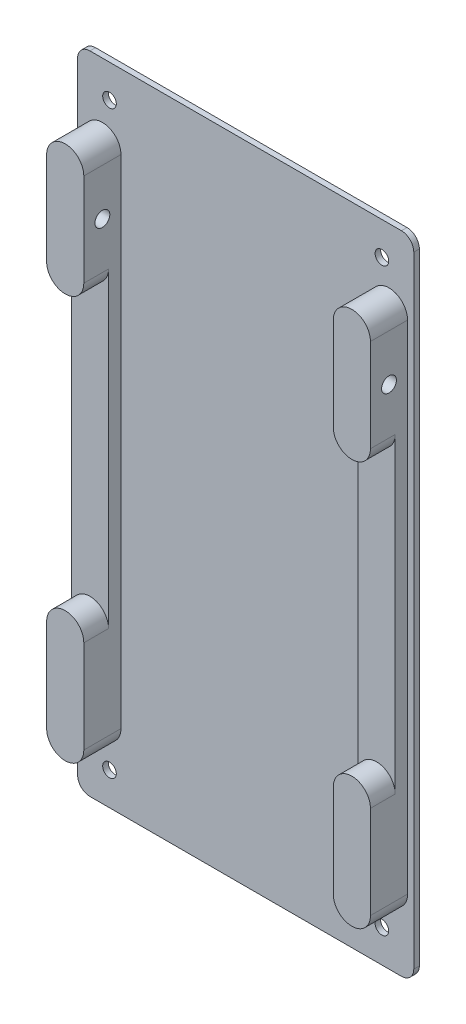
ISO-10303-21;
HEADER;
FILE_DESCRIPTION(('STEP AP214'),'2;1');
FILE_NAME('part.step','',(''),(''),'','','');
FILE_SCHEMA(('AUTOMOTIVE_DESIGN { 1 0 10303 214 1 1 1 1 }'));
ENDSEC;
DATA;
#1=APPLICATION_CONTEXT('core data for automotive mechanical design processes');
#2=APPLICATION_PROTOCOL_DEFINITION('international standard','automotive_design',2000,#1);
#3=PRODUCT_CONTEXT('',#1,'mechanical');
#4=PRODUCT('Part','Part','',(#3));
#5=PRODUCT_RELATED_PRODUCT_CATEGORY('part','',(#4));
#6=PRODUCT_DEFINITION_FORMATION('','',#4);
#7=PRODUCT_DEFINITION_CONTEXT('part definition',#1,'design');
#8=PRODUCT_DEFINITION('design','',#6,#7);
#9=PRODUCT_DEFINITION_SHAPE('','',#8);
#10=(LENGTH_UNIT() NAMED_UNIT(*) SI_UNIT(.MILLI.,.METRE.));
#11=(NAMED_UNIT(*) PLANE_ANGLE_UNIT() SI_UNIT($,.RADIAN.));
#12=(NAMED_UNIT(*) SI_UNIT($,.STERADIAN.) SOLID_ANGLE_UNIT());
#13=UNCERTAINTY_MEASURE_WITH_UNIT(LENGTH_MEASURE(1.E-05),#10,'distance_accuracy_value','');
#14=(GEOMETRIC_REPRESENTATION_CONTEXT(3) GLOBAL_UNCERTAINTY_ASSIGNED_CONTEXT((#13)) GLOBAL_UNIT_ASSIGNED_CONTEXT((#10,
#11,#12)) REPRESENTATION_CONTEXT('',''));
#15=CARTESIAN_POINT('',(0.,0.,0.));
#16=DIRECTION('',(0.,0.,1.));
#17=DIRECTION('',(1.,0.,0.));
#18=AXIS2_PLACEMENT_3D('',#15,#16,#17);
#19=CARTESIAN_POINT('',(0.,0.,0.9));
#20=DIRECTION('',(0.,0.,-1.));
#21=DIRECTION('',(-1.,0.,0.));
#22=AXIS2_PLACEMENT_3D('',#19,#20,#21);
#23=PLANE('',#22);
#24=CARTESIAN_POINT('',(4.00000000000001,12.,0.9));
#25=DIRECTION('',(0.,0.,1.));
#26=DIRECTION('',(1.,0.,0.));
#27=AXIS2_PLACEMENT_3D('',#24,#25,#26);
#28=CIRCLE('',#27,3.);
#29=CARTESIAN_POINT('',(1.00000000000001,12.,0.9));
#30=VERTEX_POINT('',#29);
#31=CARTESIAN_POINT('',(7.00000000000001,12.,0.9));
#32=VERTEX_POINT('',#31);
#33=EDGE_CURVE('E217',#30,#32,#28,.T.);
#34=ORIENTED_EDGE('',*,*,#33,.F.);
#35=DIRECTION('',(0.,-1.,0.));
#36=VECTOR('',#35,1.);
#37=CARTESIAN_POINT('',(1.,92.3,0.9));
#38=LINE('',#37,#36);
#39=CARTESIAN_POINT('',(1.,92.3,0.9));
#40=VERTEX_POINT('',#39);
#41=EDGE_CURVE('E285',#40,#30,#38,.T.);
#42=ORIENTED_EDGE('',*,*,#41,.F.);
#43=CARTESIAN_POINT('',(4.,92.3,0.9));
#44=DIRECTION('',(0.,0.,1.));
#45=DIRECTION('',(1.,0.,0.));
#46=AXIS2_PLACEMENT_3D('',#43,#44,#45);
#47=CIRCLE('',#46,3.);
#48=CARTESIAN_POINT('',(7.,92.3,0.9));
#49=VERTEX_POINT('',#48);
#50=EDGE_CURVE('E271',#49,#40,#47,.T.);
#51=ORIENTED_EDGE('',*,*,#50,.F.);
#52=DIRECTION('',(0.,1.,0.));
#53=VECTOR('',#52,1.);
#54=CARTESIAN_POINT('',(7.,92.3,0.9));
#55=LINE('',#54,#53);
#56=EDGE_CURVE('E276',#32,#49,#55,.T.);
#57=ORIENTED_EDGE('',*,*,#56,.F.);
#58=EDGE_LOOP('',(#34,#42,#51,#57));
#59=FACE_BOUND('',#58,.T.);
#60=CARTESIAN_POINT('',(49.15,99.,0.9));
#61=DIRECTION('',(0.,0.,1.));
#62=DIRECTION('',(1.,0.,0.));
#63=AXIS2_PLACEMENT_3D('',#60,#61,#62);
#64=CIRCLE('',#63,1.10000000000001);
#65=CARTESIAN_POINT('',(50.25,99.,0.9));
#66=VERTEX_POINT('',#65);
#67=EDGE_CURVE('E310',#66,#66,#64,.T.);
#68=ORIENTED_EDGE('',*,*,#67,.F.);
#69=EDGE_LOOP('',(#68));
#70=FACE_BOUND('',#69,.T.);
#71=CARTESIAN_POINT('',(5.15,5.3,0.9));
#72=DIRECTION('',(0.,0.,1.));
#73=DIRECTION('',(1.,0.,0.));
#74=AXIS2_PLACEMENT_3D('',#71,#72,#73);
#75=CIRCLE('',#74,1.1);
#76=CARTESIAN_POINT('',(6.25,5.3,0.9));
#77=VERTEX_POINT('',#76);
#78=EDGE_CURVE('E303',#77,#77,#75,.T.);
#79=ORIENTED_EDGE('',*,*,#78,.F.);
#80=EDGE_LOOP('',(#79));
#81=FACE_BOUND('',#80,.T.);
#82=CARTESIAN_POINT('',(49.15,5.3,0.9));
#83=DIRECTION('',(0.,0.,1.));
#84=DIRECTION('',(1.,0.,0.));
#85=AXIS2_PLACEMENT_3D('',#82,#83,#84);
#86=CIRCLE('',#85,1.1);
#87=CARTESIAN_POINT('',(50.25,5.3,0.9));
#88=VERTEX_POINT('',#87);
#89=EDGE_CURVE('E299',#88,#88,#86,.T.);
#90=ORIENTED_EDGE('',*,*,#89,.F.);
#91=EDGE_LOOP('',(#90));
#92=FACE_BOUND('',#91,.T.);
#93=CARTESIAN_POINT('',(5.15,99.,0.9));
#94=DIRECTION('',(0.,0.,1.));
#95=DIRECTION('',(1.,0.,0.));
#96=AXIS2_PLACEMENT_3D('',#93,#94,#95);
#97=CIRCLE('',#96,1.1);
#98=CARTESIAN_POINT('',(6.25,99.,0.9));
#99=VERTEX_POINT('',#98);
#100=EDGE_CURVE('E309',#99,#99,#97,.T.);
#101=ORIENTED_EDGE('',*,*,#100,.F.);
#102=EDGE_LOOP('',(#101));
#103=FACE_BOUND('',#102,.T.);
#104=DIRECTION('',(0.,-1.,0.));
#105=VECTOR('',#104,1.);
#106=CARTESIAN_POINT('',(0.,0.,0.9));
#107=LINE('',#106,#105);
#108=CARTESIAN_POINT('',(0.,102.3,0.9));
#109=VERTEX_POINT('',#108);
#110=CARTESIAN_POINT('',(0.,2.,0.9));
#111=VERTEX_POINT('',#110);
#112=EDGE_CURVE('E324',#109,#111,#107,.T.);
#113=ORIENTED_EDGE('',*,*,#112,.T.);
#114=CARTESIAN_POINT('',(2.,2.,0.9));
#115=DIRECTION('',(0.,0.,-1.));
#116=DIRECTION('',(-1.,0.,0.));
#117=AXIS2_PLACEMENT_3D('',#114,#115,#116);
#118=CIRCLE('',#117,2.);
#119=CARTESIAN_POINT('',(2.,0.,0.9));
#120=VERTEX_POINT('',#119);
#121=EDGE_CURVE('E371',#111,#120,#118,.F.);
#122=ORIENTED_EDGE('',*,*,#121,.T.);
#123=DIRECTION('',(1.,0.,0.));
#124=VECTOR('',#123,1.);
#125=CARTESIAN_POINT('',(0.,0.,0.9));
#126=LINE('',#125,#124);
#127=CARTESIAN_POINT('',(52.3,0.,0.9));
#128=VERTEX_POINT('',#127);
#129=EDGE_CURVE('E327',#120,#128,#126,.T.);
#130=ORIENTED_EDGE('',*,*,#129,.T.);
#131=CARTESIAN_POINT('',(52.3,2.,0.9));
#132=DIRECTION('',(0.,0.,-1.));
#133=DIRECTION('',(-1.,0.,0.));
#134=AXIS2_PLACEMENT_3D('',#131,#132,#133);
#135=CIRCLE('',#134,2.);
#136=CARTESIAN_POINT('',(54.3,2.,0.9));
#137=VERTEX_POINT('',#136);
#138=EDGE_CURVE('E369',#128,#137,#135,.F.);
#139=ORIENTED_EDGE('',*,*,#138,.T.);
#140=DIRECTION('',(0.,1.,0.));
#141=VECTOR('',#140,1.);
#142=CARTESIAN_POINT('',(54.3,0.,0.9));
#143=LINE('',#142,#141);
#144=CARTESIAN_POINT('',(54.3,102.3,0.9));
#145=VERTEX_POINT('',#144);
#146=EDGE_CURVE('E331',#137,#145,#143,.T.);
#147=ORIENTED_EDGE('',*,*,#146,.T.);
#148=CARTESIAN_POINT('',(52.3,102.3,0.9));
#149=DIRECTION('',(0.,0.,-1.));
#150=DIRECTION('',(-1.,0.,0.));
#151=AXIS2_PLACEMENT_3D('',#148,#149,#150);
#152=CIRCLE('',#151,2.);
#153=CARTESIAN_POINT('',(52.3,104.3,0.9));
#154=VERTEX_POINT('',#153);
#155=EDGE_CURVE('E365',#145,#154,#152,.F.);
#156=ORIENTED_EDGE('',*,*,#155,.T.);
#157=DIRECTION('',(-1.,0.,0.));
#158=VECTOR('',#157,1.);
#159=CARTESIAN_POINT('',(0.,104.3,0.9));
#160=LINE('',#159,#158);
#161=CARTESIAN_POINT('',(2.,104.3,0.9));
#162=VERTEX_POINT('',#161);
#163=EDGE_CURVE('E334',#154,#162,#160,.T.);
#164=ORIENTED_EDGE('',*,*,#163,.T.);
#165=CARTESIAN_POINT('',(2.,102.3,0.9));
#166=DIRECTION('',(0.,0.,-1.));
#167=DIRECTION('',(-1.,0.,0.));
#168=AXIS2_PLACEMENT_3D('',#165,#166,#167);
#169=CIRCLE('',#168,2.);
#170=EDGE_CURVE('E367',#162,#109,#169,.F.);
#171=ORIENTED_EDGE('',*,*,#170,.T.);
#172=EDGE_LOOP('',(#113,#122,#130,#139,#147,#156,#164,#171));
#173=FACE_BOUND('',#172,.T.);
#174=DIRECTION('',(0.,1.,0.));
#175=VECTOR('',#174,1.);
#176=CARTESIAN_POINT('',(53.3,92.3,0.9));
#177=LINE('',#176,#175);
#178=CARTESIAN_POINT('',(53.3,12.,0.9));
#179=VERTEX_POINT('',#178);
#180=CARTESIAN_POINT('',(53.3,92.3,0.9));
#181=VERTEX_POINT('',#180);
#182=EDGE_CURVE('E250',#179,#181,#177,.T.);
#183=ORIENTED_EDGE('',*,*,#182,.F.);
#184=CARTESIAN_POINT('',(50.3,12.,0.9));
#185=DIRECTION('',(0.,0.,1.));
#186=DIRECTION('',(1.,0.,0.));
#187=AXIS2_PLACEMENT_3D('',#184,#185,#186);
#188=CIRCLE('',#187,3.);
#189=CARTESIAN_POINT('',(47.3,12.,0.9));
#190=VERTEX_POINT('',#189);
#191=EDGE_CURVE('E214',#190,#179,#188,.T.);
#192=ORIENTED_EDGE('',*,*,#191,.F.);
#193=DIRECTION('',(0.,-1.,0.));
#194=VECTOR('',#193,1.);
#195=CARTESIAN_POINT('',(47.3,92.3,0.9));
#196=LINE('',#195,#194);
#197=CARTESIAN_POINT('',(47.3,92.3,0.9));
#198=VERTEX_POINT('',#197);
#199=EDGE_CURVE('E259',#198,#190,#196,.T.);
#200=ORIENTED_EDGE('',*,*,#199,.F.);
#201=CARTESIAN_POINT('',(50.3,92.3,0.9));
#202=DIRECTION('',(0.,0.,1.));
#203=DIRECTION('',(1.,0.,0.));
#204=AXIS2_PLACEMENT_3D('',#201,#202,#203);
#205=CIRCLE('',#204,2.99999999999999);
#206=EDGE_CURVE('E245',#181,#198,#205,.T.);
#207=ORIENTED_EDGE('',*,*,#206,.F.);
#208=EDGE_LOOP('',(#183,#192,#200,#207));
#209=FACE_BOUND('',#208,.T.);
#210=ADVANCED_FACE('F33',(#59,#70,#81,#92,#103,#173,#209),#23,.F.);
#211=CARTESIAN_POINT('',(50.3,77.3,6.9));
#212=DIRECTION('',(0.,0.,-1.));
#213=DIRECTION('',(-1.,0.,0.));
#214=AXIS2_PLACEMENT_3D('',#211,#212,#213);
#215=CYLINDRICAL_SURFACE('',#214,2.99999999999999);
#216=CARTESIAN_POINT('',(50.3,77.3,2.9));
#217=DIRECTION('',(0.,0.,-1.));
#218=DIRECTION('',(-1.,0.,0.));
#219=AXIS2_PLACEMENT_3D('',#216,#217,#218);
#220=CIRCLE('',#219,2.99999999999999);
#221=CARTESIAN_POINT('',(53.3,77.3,2.9));
#222=VERTEX_POINT('',#221);
#223=CARTESIAN_POINT('',(47.3,77.3,2.9));
#224=VERTEX_POINT('',#223);
#225=EDGE_CURVE('E52',#222,#224,#220,.T.);
#226=ORIENTED_EDGE('',*,*,#225,.F.);
#227=DIRECTION('',(0.,0.,-1.));
#228=VECTOR('',#227,1.);
#229=CARTESIAN_POINT('',(53.3,77.3,6.9));
#230=LINE('',#229,#228);
#231=CARTESIAN_POINT('',(53.3,77.3,6.9));
#232=VERTEX_POINT('',#231);
#233=EDGE_CURVE('E265',#232,#222,#230,.T.);
#234=ORIENTED_EDGE('',*,*,#233,.F.);
#235=CARTESIAN_POINT('',(50.3,77.3,6.9));
#236=DIRECTION('',(0.,0.,1.));
#237=DIRECTION('',(1.,0.,0.));
#238=AXIS2_PLACEMENT_3D('',#235,#236,#237);
#239=CIRCLE('',#238,2.99999999999999);
#240=CARTESIAN_POINT('',(47.3,77.3,6.9));
#241=VERTEX_POINT('',#240);
#242=EDGE_CURVE('E252',#241,#232,#239,.T.);
#243=ORIENTED_EDGE('',*,*,#242,.F.);
#244=DIRECTION('',(0.,0.,-1.));
#245=VECTOR('',#244,1.);
#246=CARTESIAN_POINT('',(47.3,77.3,6.9));
#247=LINE('',#246,#245);
#248=EDGE_CURVE('E48',#241,#224,#247,.T.);
#249=ORIENTED_EDGE('',*,*,#248,.T.);
#250=EDGE_LOOP('',(#226,#234,#243,#249));
#251=FACE_BOUND('',#250,.T.);
#252=ADVANCED_FACE('F444',(#251),#215,.T.);
#253=CARTESIAN_POINT('',(50.3,27.,6.9));
#254=DIRECTION('',(0.,0.,-1.));
#255=DIRECTION('',(-1.,0.,0.));
#256=AXIS2_PLACEMENT_3D('',#253,#254,#255);
#257=CYLINDRICAL_SURFACE('',#256,3.);
#258=CARTESIAN_POINT('',(50.3,27.,2.9));
#259=DIRECTION('',(0.,0.,-1.));
#260=DIRECTION('',(-1.,0.,0.));
#261=AXIS2_PLACEMENT_3D('',#258,#259,#260);
#262=CIRCLE('',#261,3.);
#263=CARTESIAN_POINT('',(47.3,27.,2.9));
#264=VERTEX_POINT('',#263);
#265=CARTESIAN_POINT('',(53.3,27.,2.9));
#266=VERTEX_POINT('',#265);
#267=EDGE_CURVE('E11',#264,#266,#262,.T.);
#268=ORIENTED_EDGE('',*,*,#267,.F.);
#269=DIRECTION('',(0.,0.,-1.));
#270=VECTOR('',#269,1.);
#271=CARTESIAN_POINT('',(47.3,27.,6.9));
#272=LINE('',#271,#270);
#273=CARTESIAN_POINT('',(47.3,27.,6.9));
#274=VERTEX_POINT('',#273);
#275=EDGE_CURVE('E199',#274,#264,#272,.T.);
#276=ORIENTED_EDGE('',*,*,#275,.F.);
#277=CARTESIAN_POINT('',(50.3,27.,6.9));
#278=DIRECTION('',(0.,0.,1.));
#279=DIRECTION('',(1.,0.,0.));
#280=AXIS2_PLACEMENT_3D('',#277,#278,#279);
#281=CIRCLE('',#280,3.);
#282=CARTESIAN_POINT('',(53.3,27.,6.9));
#283=VERTEX_POINT('',#282);
#284=EDGE_CURVE('E206',#283,#274,#281,.T.);
#285=ORIENTED_EDGE('',*,*,#284,.F.);
#286=DIRECTION('',(0.,0.,-1.));
#287=VECTOR('',#286,1.);
#288=CARTESIAN_POINT('',(53.3,27.,6.9));
#289=LINE('',#288,#287);
#290=EDGE_CURVE('E423',#283,#266,#289,.T.);
#291=ORIENTED_EDGE('',*,*,#290,.T.);
#292=EDGE_LOOP('',(#268,#276,#285,#291));
#293=FACE_BOUND('',#292,.T.);
#294=ADVANCED_FACE('F216',(#293),#257,.T.);
#295=CARTESIAN_POINT('',(0.,0.,0.9));
#296=DIRECTION('',(1.,0.,0.));
#297=DIRECTION('',(0.,0.,-1.));
#298=AXIS2_PLACEMENT_3D('',#295,#296,#297);
#299=PLANE('',#298);
#300=DIRECTION('',(0.,-1.,0.));
#301=VECTOR('',#300,1.);
#302=CARTESIAN_POINT('',(0.,0.,0.));
#303=LINE('',#302,#301);
#304=CARTESIAN_POINT('',(0.,102.3,0.));
#305=VERTEX_POINT('',#304);
#306=CARTESIAN_POINT('',(0.,2.,0.));
#307=VERTEX_POINT('',#306);
#308=EDGE_CURVE('E321',#305,#307,#303,.T.);
#309=ORIENTED_EDGE('',*,*,#308,.T.);
#310=DIRECTION('',(0.,0.,-1.));
#311=VECTOR('',#310,1.);
#312=CARTESIAN_POINT('',(0.,2.,0.9));
#313=LINE('',#312,#311);
#314=EDGE_CURVE('E363',#307,#111,#313,.F.);
#315=ORIENTED_EDGE('',*,*,#314,.T.);
#316=ORIENTED_EDGE('',*,*,#112,.F.);
#317=DIRECTION('',(0.,0.,-1.));
#318=VECTOR('',#317,1.);
#319=CARTESIAN_POINT('',(0.,102.3,0.9));
#320=LINE('',#319,#318);
#321=EDGE_CURVE('E360',#109,#305,#320,.T.);
#322=ORIENTED_EDGE('',*,*,#321,.T.);
#323=EDGE_LOOP('',(#309,#315,#316,#322));
#324=FACE_BOUND('',#323,.T.);
#325=ADVANCED_FACE('F451',(#324),#299,.F.);
#326=CARTESIAN_POINT('',(0.,0.,0.9));
#327=DIRECTION('',(0.,1.,0.));
#328=DIRECTION('',(0.,0.,1.));
#329=AXIS2_PLACEMENT_3D('',#326,#327,#328);
#330=PLANE('',#329);
#331=ORIENTED_EDGE('',*,*,#129,.F.);
#332=DIRECTION('',(0.,0.,-1.));
#333=VECTOR('',#332,1.);
#334=CARTESIAN_POINT('',(2.,0.,0.9));
#335=LINE('',#334,#333);
#336=CARTESIAN_POINT('',(2.,0.,0.));
#337=VERTEX_POINT('',#336);
#338=EDGE_CURVE('E349',#120,#337,#335,.T.);
#339=ORIENTED_EDGE('',*,*,#338,.T.);
#340=DIRECTION('',(1.,0.,0.));
#341=VECTOR('',#340,1.);
#342=CARTESIAN_POINT('',(0.,0.,0.));
#343=LINE('',#342,#341);
#344=CARTESIAN_POINT('',(52.3,0.,0.));
#345=VERTEX_POINT('',#344);
#346=EDGE_CURVE('E340',#337,#345,#343,.T.);
#347=ORIENTED_EDGE('',*,*,#346,.T.);
#348=DIRECTION('',(0.,0.,-1.));
#349=VECTOR('',#348,1.);
#350=CARTESIAN_POINT('',(52.3,0.,0.9));
#351=LINE('',#350,#349);
#352=EDGE_CURVE('E337',#345,#128,#351,.F.);
#353=ORIENTED_EDGE('',*,*,#352,.T.);
#354=EDGE_LOOP('',(#331,#339,#347,#353));
#355=FACE_BOUND('',#354,.T.);
#356=ADVANCED_FACE('F510',(#355),#330,.F.);
#357=CARTESIAN_POINT('',(54.3,0.,0.9));
#358=DIRECTION('',(-1.,0.,0.));
#359=DIRECTION('',(0.,0.,1.));
#360=AXIS2_PLACEMENT_3D('',#357,#358,#359);
#361=PLANE('',#360);
#362=ORIENTED_EDGE('',*,*,#146,.F.);
#363=DIRECTION('',(0.,0.,-1.));
#364=VECTOR('',#363,1.);
#365=CARTESIAN_POINT('',(54.3,2.,0.9));
#366=LINE('',#365,#364);
#367=CARTESIAN_POINT('',(54.3,2.,0.));
#368=VERTEX_POINT('',#367);
#369=EDGE_CURVE('E375',#137,#368,#366,.T.);
#370=ORIENTED_EDGE('',*,*,#369,.T.);
#371=DIRECTION('',(0.,1.,0.));
#372=VECTOR('',#371,1.);
#373=CARTESIAN_POINT('',(54.3,0.,0.));
#374=LINE('',#373,#372);
#375=CARTESIAN_POINT('',(54.3,102.3,0.));
#376=VERTEX_POINT('',#375);
#377=EDGE_CURVE('E343',#368,#376,#374,.T.);
#378=ORIENTED_EDGE('',*,*,#377,.T.);
#379=DIRECTION('',(0.,0.,-1.));
#380=VECTOR('',#379,1.);
#381=CARTESIAN_POINT('',(54.3,102.3,0.9));
#382=LINE('',#381,#380);
#383=EDGE_CURVE('E373',#376,#145,#382,.F.);
#384=ORIENTED_EDGE('',*,*,#383,.T.);
#385=EDGE_LOOP('',(#362,#370,#378,#384));
#386=FACE_BOUND('',#385,.T.);
#387=ADVANCED_FACE('F506',(#386),#361,.F.);
#388=CARTESIAN_POINT('',(0.,104.3,0.9));
#389=DIRECTION('',(0.,-1.,0.));
#390=DIRECTION('',(0.,0.,-1.));
#391=AXIS2_PLACEMENT_3D('',#388,#389,#390);
#392=PLANE('',#391);
#393=DIRECTION('',(-1.,0.,0.));
#394=VECTOR('',#393,1.);
#395=CARTESIAN_POINT('',(0.,104.3,0.));
#396=LINE('',#395,#394);
#397=CARTESIAN_POINT('',(52.3,104.3,0.));
#398=VERTEX_POINT('',#397);
#399=CARTESIAN_POINT('',(2.,104.3,0.));
#400=VERTEX_POINT('',#399);
#401=EDGE_CURVE('E328',#398,#400,#396,.T.);
#402=ORIENTED_EDGE('',*,*,#401,.T.);
#403=DIRECTION('',(0.,0.,-1.));
#404=VECTOR('',#403,1.);
#405=CARTESIAN_POINT('',(2.,104.3,0.9));
#406=LINE('',#405,#404);
#407=EDGE_CURVE('E381',#400,#162,#406,.F.);
#408=ORIENTED_EDGE('',*,*,#407,.T.);
#409=ORIENTED_EDGE('',*,*,#163,.F.);
#410=DIRECTION('',(0.,0.,-1.));
#411=VECTOR('',#410,1.);
#412=CARTESIAN_POINT('',(52.3,104.3,0.9));
#413=LINE('',#412,#411);
#414=EDGE_CURVE('E378',#154,#398,#413,.T.);
#415=ORIENTED_EDGE('',*,*,#414,.T.);
#416=EDGE_LOOP('',(#402,#408,#409,#415));
#417=FACE_BOUND('',#416,.T.);
#418=ADVANCED_FACE('F502',(#417),#392,.F.);
#419=CARTESIAN_POINT('',(0.,0.,0.));
#420=DIRECTION('',(0.,0.,-1.));
#421=DIRECTION('',(-1.,0.,0.));
#422=AXIS2_PLACEMENT_3D('',#419,#420,#421);
#423=PLANE('',#422);
#424=CARTESIAN_POINT('',(49.15,99.,0.));
#425=DIRECTION('',(0.,0.,1.));
#426=DIRECTION('',(1.,0.,0.));
#427=AXIS2_PLACEMENT_3D('',#424,#425,#426);
#428=CIRCLE('',#427,1.10000000000001);
#429=CARTESIAN_POINT('',(50.25,99.,0.));
#430=VERTEX_POINT('',#429);
#431=EDGE_CURVE('E306',#430,#430,#428,.T.);
#432=ORIENTED_EDGE('',*,*,#431,.T.);
#433=EDGE_LOOP('',(#432));
#434=FACE_BOUND('',#433,.T.);
#435=CARTESIAN_POINT('',(5.15,5.3,0.));
#436=DIRECTION('',(0.,0.,1.));
#437=DIRECTION('',(1.,0.,0.));
#438=AXIS2_PLACEMENT_3D('',#435,#436,#437);
#439=CIRCLE('',#438,1.1);
#440=CARTESIAN_POINT('',(6.25,5.3,0.));
#441=VERTEX_POINT('',#440);
#442=EDGE_CURVE('E313',#441,#441,#439,.T.);
#443=ORIENTED_EDGE('',*,*,#442,.T.);
#444=EDGE_LOOP('',(#443));
#445=FACE_BOUND('',#444,.T.);
#446=CARTESIAN_POINT('',(49.15,5.3,0.));
#447=DIRECTION('',(0.,0.,1.));
#448=DIRECTION('',(1.,0.,0.));
#449=AXIS2_PLACEMENT_3D('',#446,#447,#448);
#450=CIRCLE('',#449,1.1);
#451=CARTESIAN_POINT('',(50.25,5.3,0.));
#452=VERTEX_POINT('',#451);
#453=EDGE_CURVE('E300',#452,#452,#450,.T.);
#454=ORIENTED_EDGE('',*,*,#453,.T.);
#455=EDGE_LOOP('',(#454));
#456=FACE_BOUND('',#455,.T.);
#457=CARTESIAN_POINT('',(5.15,99.,0.));
#458=DIRECTION('',(0.,0.,1.));
#459=DIRECTION('',(1.,0.,0.));
#460=AXIS2_PLACEMENT_3D('',#457,#458,#459);
#461=CIRCLE('',#460,1.1);
#462=CARTESIAN_POINT('',(6.25,99.,0.));
#463=VERTEX_POINT('',#462);
#464=EDGE_CURVE('E318',#463,#463,#461,.T.);
#465=ORIENTED_EDGE('',*,*,#464,.T.);
#466=EDGE_LOOP('',(#465));
#467=FACE_BOUND('',#466,.T.);
#468=ORIENTED_EDGE('',*,*,#346,.F.);
#469=CARTESIAN_POINT('',(2.,2.,0.));
#470=DIRECTION('',(0.,0.,-1.));
#471=DIRECTION('',(-1.,0.,0.));
#472=AXIS2_PLACEMENT_3D('',#469,#470,#471);
#473=CIRCLE('',#472,2.);
#474=EDGE_CURVE('E358',#337,#307,#473,.T.);
#475=ORIENTED_EDGE('',*,*,#474,.T.);
#476=ORIENTED_EDGE('',*,*,#308,.F.);
#477=CARTESIAN_POINT('',(2.,102.3,0.));
#478=DIRECTION('',(0.,0.,-1.));
#479=DIRECTION('',(-1.,0.,0.));
#480=AXIS2_PLACEMENT_3D('',#477,#478,#479);
#481=CIRCLE('',#480,2.);
#482=EDGE_CURVE('E354',#305,#400,#481,.T.);
#483=ORIENTED_EDGE('',*,*,#482,.T.);
#484=ORIENTED_EDGE('',*,*,#401,.F.);
#485=CARTESIAN_POINT('',(52.3,102.3,0.));
#486=DIRECTION('',(0.,0.,-1.));
#487=DIRECTION('',(-1.,0.,0.));
#488=AXIS2_PLACEMENT_3D('',#485,#486,#487);
#489=CIRCLE('',#488,2.);
#490=EDGE_CURVE('E352',#398,#376,#489,.T.);
#491=ORIENTED_EDGE('',*,*,#490,.T.);
#492=ORIENTED_EDGE('',*,*,#377,.F.);
#493=CARTESIAN_POINT('',(52.3,2.,0.));
#494=DIRECTION('',(0.,0.,-1.));
#495=DIRECTION('',(-1.,0.,0.));
#496=AXIS2_PLACEMENT_3D('',#493,#494,#495);
#497=CIRCLE('',#496,2.);
#498=EDGE_CURVE('E356',#368,#345,#497,.T.);
#499=ORIENTED_EDGE('',*,*,#498,.T.);
#500=EDGE_LOOP('',(#468,#475,#476,#483,#484,#491,#492,#499));
#501=FACE_BOUND('',#500,.T.);
#502=ADVANCED_FACE('F498',(#434,#445,#456,#467,#501),#423,.T.);
#503=CARTESIAN_POINT('',(2.,2.,0.9));
#504=DIRECTION('',(0.,0.,-1.));
#505=DIRECTION('',(-1.,0.,0.));
#506=AXIS2_PLACEMENT_3D('',#503,#504,#505);
#507=CYLINDRICAL_SURFACE('',#506,2.);
#508=ORIENTED_EDGE('',*,*,#121,.F.);
#509=ORIENTED_EDGE('',*,*,#314,.F.);
#510=ORIENTED_EDGE('',*,*,#474,.F.);
#511=ORIENTED_EDGE('',*,*,#338,.F.);
#512=EDGE_LOOP('',(#508,#509,#510,#511));
#513=FACE_BOUND('',#512,.T.);
#514=ADVANCED_FACE('F501',(#513),#507,.T.);
#515=CARTESIAN_POINT('',(52.3,2.,0.9));
#516=DIRECTION('',(0.,0.,-1.));
#517=DIRECTION('',(-1.,0.,0.));
#518=AXIS2_PLACEMENT_3D('',#515,#516,#517);
#519=CYLINDRICAL_SURFACE('',#518,2.);
#520=ORIENTED_EDGE('',*,*,#138,.F.);
#521=ORIENTED_EDGE('',*,*,#352,.F.);
#522=ORIENTED_EDGE('',*,*,#498,.F.);
#523=ORIENTED_EDGE('',*,*,#369,.F.);
#524=EDGE_LOOP('',(#520,#521,#522,#523));
#525=FACE_BOUND('',#524,.T.);
#526=ADVANCED_FACE('F520',(#525),#519,.T.);
#527=CARTESIAN_POINT('',(2.,102.3,0.9));
#528=DIRECTION('',(0.,0.,-1.));
#529=DIRECTION('',(-1.,0.,0.));
#530=AXIS2_PLACEMENT_3D('',#527,#528,#529);
#531=CYLINDRICAL_SURFACE('',#530,2.);
#532=ORIENTED_EDGE('',*,*,#170,.F.);
#533=ORIENTED_EDGE('',*,*,#407,.F.);
#534=ORIENTED_EDGE('',*,*,#482,.F.);
#535=ORIENTED_EDGE('',*,*,#321,.F.);
#536=EDGE_LOOP('',(#532,#533,#534,#535));
#537=FACE_BOUND('',#536,.T.);
#538=ADVANCED_FACE('F523',(#537),#531,.T.);
#539=CARTESIAN_POINT('',(52.3,102.3,0.9));
#540=DIRECTION('',(0.,0.,-1.));
#541=DIRECTION('',(-1.,0.,0.));
#542=AXIS2_PLACEMENT_3D('',#539,#540,#541);
#543=CYLINDRICAL_SURFACE('',#542,2.);
#544=ORIENTED_EDGE('',*,*,#155,.F.);
#545=ORIENTED_EDGE('',*,*,#383,.F.);
#546=ORIENTED_EDGE('',*,*,#490,.F.);
#547=ORIENTED_EDGE('',*,*,#414,.F.);
#548=EDGE_LOOP('',(#544,#545,#546,#547));
#549=FACE_BOUND('',#548,.T.);
#550=ADVANCED_FACE('F35',(#549),#543,.T.);
#551=CARTESIAN_POINT('',(5.15,99.,0.));
#552=DIRECTION('',(0.,0.,1.));
#553=DIRECTION('',(1.,0.,0.));
#554=AXIS2_PLACEMENT_3D('',#551,#552,#553);
#555=CYLINDRICAL_SURFACE('',#554,1.1);
#556=ORIENTED_EDGE('',*,*,#464,.F.);
#557=EDGE_LOOP('',(#556));
#558=FACE_BOUND('',#557,.T.);
#559=ORIENTED_EDGE('',*,*,#100,.T.);
#560=EDGE_LOOP('',(#559));
#561=FACE_BOUND('',#560,.T.);
#562=ADVANCED_FACE('F487',(#558,#561),#555,.F.);
#563=CARTESIAN_POINT('',(49.15,5.3,0.));
#564=DIRECTION('',(0.,0.,1.));
#565=DIRECTION('',(1.,0.,0.));
#566=AXIS2_PLACEMENT_3D('',#563,#564,#565);
#567=CYLINDRICAL_SURFACE('',#566,1.1);
#568=ORIENTED_EDGE('',*,*,#453,.F.);
#569=EDGE_LOOP('',(#568));
#570=FACE_BOUND('',#569,.T.);
#571=ORIENTED_EDGE('',*,*,#89,.T.);
#572=EDGE_LOOP('',(#571));
#573=FACE_BOUND('',#572,.T.);
#574=ADVANCED_FACE('F483',(#570,#573),#567,.F.);
#575=CARTESIAN_POINT('',(5.15,5.3,0.));
#576=DIRECTION('',(0.,0.,1.));
#577=DIRECTION('',(1.,0.,0.));
#578=AXIS2_PLACEMENT_3D('',#575,#576,#577);
#579=CYLINDRICAL_SURFACE('',#578,1.1);
#580=ORIENTED_EDGE('',*,*,#442,.F.);
#581=EDGE_LOOP('',(#580));
#582=FACE_BOUND('',#581,.T.);
#583=ORIENTED_EDGE('',*,*,#78,.T.);
#584=EDGE_LOOP('',(#583));
#585=FACE_BOUND('',#584,.T.);
#586=ADVANCED_FACE('F486',(#582,#585),#579,.F.);
#587=CARTESIAN_POINT('',(49.15,99.,0.));
#588=DIRECTION('',(0.,0.,1.));
#589=DIRECTION('',(1.,0.,0.));
#590=AXIS2_PLACEMENT_3D('',#587,#588,#589);
#591=CYLINDRICAL_SURFACE('',#590,1.10000000000001);
#592=ORIENTED_EDGE('',*,*,#431,.F.);
#593=EDGE_LOOP('',(#592));
#594=FACE_BOUND('',#593,.T.);
#595=ORIENTED_EDGE('',*,*,#67,.T.);
#596=EDGE_LOOP('',(#595));
#597=FACE_BOUND('',#596,.T.);
#598=ADVANCED_FACE('F481',(#594,#597),#591,.F.);
#599=CARTESIAN_POINT('',(4.,92.3,6.9));
#600=DIRECTION('',(0.,0.,-1.));
#601=DIRECTION('',(-1.,0.,0.));
#602=AXIS2_PLACEMENT_3D('',#599,#600,#601);
#603=CYLINDRICAL_SURFACE('',#602,3.);
#604=ORIENTED_EDGE('',*,*,#50,.T.);
#605=DIRECTION('',(0.,0.,-1.));
#606=VECTOR('',#605,1.);
#607=CARTESIAN_POINT('',(1.,92.3,6.9));
#608=LINE('',#607,#606);
#609=CARTESIAN_POINT('',(1.,92.3,6.9));
#610=VERTEX_POINT('',#609);
#611=EDGE_CURVE('E296',#610,#40,#608,.T.);
#612=ORIENTED_EDGE('',*,*,#611,.F.);
#613=CARTESIAN_POINT('',(4.,92.3,6.9));
#614=DIRECTION('',(0.,0.,1.));
#615=DIRECTION('',(1.,0.,0.));
#616=AXIS2_PLACEMENT_3D('',#613,#614,#615);
#617=CIRCLE('',#616,3.);
#618=CARTESIAN_POINT('',(7.,92.3,6.9));
#619=VERTEX_POINT('',#618);
#620=EDGE_CURVE('E272',#619,#610,#617,.T.);
#621=ORIENTED_EDGE('',*,*,#620,.F.);
#622=DIRECTION('',(0.,0.,-1.));
#623=VECTOR('',#622,1.);
#624=CARTESIAN_POINT('',(7.,92.3,6.9));
#625=LINE('',#624,#623);
#626=EDGE_CURVE('E282',#619,#49,#625,.T.);
#627=ORIENTED_EDGE('',*,*,#626,.T.);
#628=EDGE_LOOP('',(#604,#612,#621,#627));
#629=FACE_BOUND('',#628,.T.);
#630=ADVANCED_FACE('F477',(#629),#603,.T.);
#631=CARTESIAN_POINT('',(1.,92.3,6.9));
#632=DIRECTION('',(1.,0.,0.));
#633=DIRECTION('',(0.,0.,-1.));
#634=AXIS2_PLACEMENT_3D('',#631,#632,#633);
#635=PLANE('',#634);
#636=CARTESIAN_POINT('',(1.,84.8,3.9));
#637=DIRECTION('',(1.,0.,0.));
#638=DIRECTION('',(0.,0.,-1.));
#639=AXIS2_PLACEMENT_3D('',#636,#637,#638);
#640=CIRCLE('',#639,1.2);
#641=CARTESIAN_POINT('',(1.,84.8,2.7));
#642=VERTEX_POINT('',#641);
#643=EDGE_CURVE('E418',#642,#642,#640,.T.);
#644=ORIENTED_EDGE('',*,*,#643,.T.);
#645=EDGE_LOOP('',(#644));
#646=FACE_BOUND('',#645,.T.);
#647=ORIENTED_EDGE('',*,*,#41,.T.);
#648=DIRECTION('',(0.,0.,-1.));
#649=VECTOR('',#648,1.);
#650=CARTESIAN_POINT('',(1.00000000000001,12.,6.9));
#651=LINE('',#650,#649);
#652=CARTESIAN_POINT('',(1.00000000000001,12.,6.9));
#653=VERTEX_POINT('',#652);
#654=EDGE_CURVE('E239',#653,#30,#651,.T.);
#655=ORIENTED_EDGE('',*,*,#654,.F.);
#656=DIRECTION('',(0.,-1.,0.));
#657=VECTOR('',#656,1.);
#658=CARTESIAN_POINT('',(1.00000000000001,27.,6.9));
#659=LINE('',#658,#657);
#660=CARTESIAN_POINT('',(1.00000000000001,27.,6.9));
#661=VERTEX_POINT('',#660);
#662=EDGE_CURVE('E228',#661,#653,#659,.T.);
#663=ORIENTED_EDGE('',*,*,#662,.F.);
#664=DIRECTION('',(0.,0.,-1.));
#665=VECTOR('',#664,1.);
#666=CARTESIAN_POINT('',(1.00000000000001,27.,6.9));
#667=LINE('',#666,#665);
#668=CARTESIAN_POINT('',(1.00000000000001,27.,2.9));
#669=VERTEX_POINT('',#668);
#670=EDGE_CURVE('E242',#661,#669,#667,.T.);
#671=ORIENTED_EDGE('',*,*,#670,.T.);
#672=DIRECTION('',(0.,-1.,0.));
#673=VECTOR('',#672,1.);
#674=CARTESIAN_POINT('',(1.,77.3,2.9));
#675=LINE('',#674,#673);
#676=CARTESIAN_POINT('',(1.,77.3,2.9));
#677=VERTEX_POINT('',#676);
#678=EDGE_CURVE('E401',#677,#669,#675,.T.);
#679=ORIENTED_EDGE('',*,*,#678,.F.);
#680=DIRECTION('',(0.,0.,-1.));
#681=VECTOR('',#680,1.);
#682=CARTESIAN_POINT('',(1.,77.3,6.9));
#683=LINE('',#682,#681);
#684=CARTESIAN_POINT('',(1.,77.3,6.9));
#685=VERTEX_POINT('',#684);
#686=EDGE_CURVE('E294',#685,#677,#683,.T.);
#687=ORIENTED_EDGE('',*,*,#686,.F.);
#688=DIRECTION('',(0.,-1.,0.));
#689=VECTOR('',#688,1.);
#690=CARTESIAN_POINT('',(1.,92.3,6.9));
#691=LINE('',#690,#689);
#692=EDGE_CURVE('E275',#610,#685,#691,.T.);
#693=ORIENTED_EDGE('',*,*,#692,.F.);
#694=ORIENTED_EDGE('',*,*,#611,.T.);
#695=EDGE_LOOP('',(#647,#655,#663,#671,#679,#687,#693,#694));
#696=FACE_BOUND('',#695,.T.);
#697=ADVANCED_FACE('F399',(#646,#696),#635,.F.);
#698=CARTESIAN_POINT('',(4.,77.3,6.9));
#699=DIRECTION('',(0.,0.,-1.));
#700=DIRECTION('',(-1.,0.,0.));
#701=AXIS2_PLACEMENT_3D('',#698,#699,#700);
#702=CYLINDRICAL_SURFACE('',#701,3.);
#703=ORIENTED_EDGE('',*,*,#686,.T.);
#704=CARTESIAN_POINT('',(4.,77.3,2.9));
#705=DIRECTION('',(0.,0.,1.));
#706=DIRECTION('',(1.,0.,0.));
#707=AXIS2_PLACEMENT_3D('',#704,#705,#706);
#708=CIRCLE('',#707,3.);
#709=CARTESIAN_POINT('',(7.,77.3,2.9));
#710=VERTEX_POINT('',#709);
#711=EDGE_CURVE('E386',#677,#710,#708,.T.);
#712=ORIENTED_EDGE('',*,*,#711,.T.);
#713=DIRECTION('',(0.,0.,-1.));
#714=VECTOR('',#713,1.);
#715=CARTESIAN_POINT('',(7.,77.3,6.9));
#716=LINE('',#715,#714);
#717=CARTESIAN_POINT('',(7.,77.3,6.9));
#718=VERTEX_POINT('',#717);
#719=EDGE_CURVE('E291',#718,#710,#716,.T.);
#720=ORIENTED_EDGE('',*,*,#719,.F.);
#721=CARTESIAN_POINT('',(4.,77.3,6.9));
#722=DIRECTION('',(0.,0.,1.));
#723=DIRECTION('',(1.,0.,0.));
#724=AXIS2_PLACEMENT_3D('',#721,#722,#723);
#725=CIRCLE('',#724,3.);
#726=EDGE_CURVE('E278',#685,#718,#725,.T.);
#727=ORIENTED_EDGE('',*,*,#726,.F.);
#728=EDGE_LOOP('',(#703,#712,#720,#727));
#729=FACE_BOUND('',#728,.T.);
#730=ADVANCED_FACE('F470',(#729),#702,.T.);
#731=CARTESIAN_POINT('',(7.,92.3,6.9));
#732=DIRECTION('',(-1.,0.,0.));
#733=DIRECTION('',(0.,-1.,0.));
#734=AXIS2_PLACEMENT_3D('',#731,#732,#733);
#735=PLANE('',#734);
#736=CARTESIAN_POINT('',(7.,84.8,3.9));
#737=DIRECTION('',(-1.,0.,0.));
#738=DIRECTION('',(0.,-1.,0.));
#739=AXIS2_PLACEMENT_3D('',#736,#737,#738);
#740=CIRCLE('',#739,1.2);
#741=CARTESIAN_POINT('',(7.,83.6,3.9));
#742=VERTEX_POINT('',#741);
#743=EDGE_CURVE('E415',#742,#742,#740,.T.);
#744=ORIENTED_EDGE('',*,*,#743,.T.);
#745=EDGE_LOOP('',(#744));
#746=FACE_BOUND('',#745,.T.);
#747=ORIENTED_EDGE('',*,*,#56,.T.);
#748=ORIENTED_EDGE('',*,*,#626,.F.);
#749=DIRECTION('',(0.,1.,0.));
#750=VECTOR('',#749,1.);
#751=CARTESIAN_POINT('',(7.,92.3,6.9));
#752=LINE('',#751,#750);
#753=EDGE_CURVE('E280',#718,#619,#752,.T.);
#754=ORIENTED_EDGE('',*,*,#753,.F.);
#755=ORIENTED_EDGE('',*,*,#719,.T.);
#756=DIRECTION('',(0.,1.,0.));
#757=VECTOR('',#756,1.);
#758=CARTESIAN_POINT('',(7.00000000000001,77.3,2.9));
#759=LINE('',#758,#757);
#760=CARTESIAN_POINT('',(7.00000000000001,27.,2.9));
#761=VERTEX_POINT('',#760);
#762=EDGE_CURVE('E405',#761,#710,#759,.T.);
#763=ORIENTED_EDGE('',*,*,#762,.F.);
#764=DIRECTION('',(0.,0.,-1.));
#765=VECTOR('',#764,1.);
#766=CARTESIAN_POINT('',(7.00000000000001,27.,6.9));
#767=LINE('',#766,#765);
#768=CARTESIAN_POINT('',(7.00000000000001,27.,6.9));
#769=VERTEX_POINT('',#768);
#770=EDGE_CURVE('E233',#769,#761,#767,.T.);
#771=ORIENTED_EDGE('',*,*,#770,.F.);
#772=DIRECTION('',(0.,1.,0.));
#773=VECTOR('',#772,1.);
#774=CARTESIAN_POINT('',(7.00000000000001,27.,6.9));
#775=LINE('',#774,#773);
#776=CARTESIAN_POINT('',(7.00000000000001,12.,6.9));
#777=VERTEX_POINT('',#776);
#778=EDGE_CURVE('E232',#777,#769,#775,.T.);
#779=ORIENTED_EDGE('',*,*,#778,.F.);
#780=DIRECTION('',(0.,0.,-1.));
#781=VECTOR('',#780,1.);
#782=CARTESIAN_POINT('',(7.00000000000001,12.,6.9));
#783=LINE('',#782,#781);
#784=EDGE_CURVE('E236',#777,#32,#783,.T.);
#785=ORIENTED_EDGE('',*,*,#784,.T.);
#786=EDGE_LOOP('',(#747,#748,#754,#755,#763,#771,#779,#785));
#787=FACE_BOUND('',#786,.T.);
#788=ADVANCED_FACE('F466',(#746,#787),#735,.F.);
#789=CARTESIAN_POINT('',(4.,92.3,6.9));
#790=DIRECTION('',(0.,0.,1.));
#791=DIRECTION('',(1.,0.,0.));
#792=AXIS2_PLACEMENT_3D('',#789,#790,#791);
#793=PLANE('',#792);
#794=ORIENTED_EDGE('',*,*,#620,.T.);
#795=ORIENTED_EDGE('',*,*,#692,.T.);
#796=ORIENTED_EDGE('',*,*,#726,.T.);
#797=ORIENTED_EDGE('',*,*,#753,.T.);
#798=EDGE_LOOP('',(#794,#795,#796,#797));
#799=FACE_BOUND('',#798,.T.);
#800=ADVANCED_FACE('F463',(#799),#793,.T.);
#801=CARTESIAN_POINT('',(50.3,92.3,6.9));
#802=DIRECTION('',(0.,0.,-1.));
#803=DIRECTION('',(-1.,0.,0.));
#804=AXIS2_PLACEMENT_3D('',#801,#802,#803);
#805=CYLINDRICAL_SURFACE('',#804,2.99999999999999);
#806=ORIENTED_EDGE('',*,*,#206,.T.);
#807=DIRECTION('',(0.,0.,-1.));
#808=VECTOR('',#807,1.);
#809=CARTESIAN_POINT('',(47.3,92.3,6.9));
#810=LINE('',#809,#808);
#811=CARTESIAN_POINT('',(47.3,92.3,6.9));
#812=VERTEX_POINT('',#811);
#813=EDGE_CURVE('E268',#812,#198,#810,.T.);
#814=ORIENTED_EDGE('',*,*,#813,.F.);
#815=CARTESIAN_POINT('',(50.3,92.3,6.9));
#816=DIRECTION('',(0.,0.,1.));
#817=DIRECTION('',(1.,0.,0.));
#818=AXIS2_PLACEMENT_3D('',#815,#816,#817);
#819=CIRCLE('',#818,2.99999999999999);
#820=CARTESIAN_POINT('',(53.3,92.3,6.9));
#821=VERTEX_POINT('',#820);
#822=EDGE_CURVE('E246',#821,#812,#819,.T.);
#823=ORIENTED_EDGE('',*,*,#822,.F.);
#824=DIRECTION('',(0.,0.,-1.));
#825=VECTOR('',#824,1.);
#826=CARTESIAN_POINT('',(53.3,92.3,6.9));
#827=LINE('',#826,#825);
#828=EDGE_CURVE('E256',#821,#181,#827,.T.);
#829=ORIENTED_EDGE('',*,*,#828,.T.);
#830=EDGE_LOOP('',(#806,#814,#823,#829));
#831=FACE_BOUND('',#830,.T.);
#832=ADVANCED_FACE('F437',(#831),#805,.T.);
#833=CARTESIAN_POINT('',(47.3,92.3,6.9));
#834=DIRECTION('',(1.,0.,0.));
#835=DIRECTION('',(0.,0.,-1.));
#836=AXIS2_PLACEMENT_3D('',#833,#834,#835);
#837=PLANE('',#836);
#838=CARTESIAN_POINT('',(47.3,84.8,3.9));
#839=DIRECTION('',(1.,0.,0.));
#840=DIRECTION('',(0.,0.,-1.));
#841=AXIS2_PLACEMENT_3D('',#838,#839,#840);
#842=CIRCLE('',#841,1.2);
#843=CARTESIAN_POINT('',(47.3,84.8,2.7));
#844=VERTEX_POINT('',#843);
#845=EDGE_CURVE('E385',#844,#844,#842,.T.);
#846=ORIENTED_EDGE('',*,*,#845,.T.);
#847=EDGE_LOOP('',(#846));
#848=FACE_BOUND('',#847,.T.);
#849=ORIENTED_EDGE('',*,*,#199,.T.);
#850=DIRECTION('',(0.,0.,-1.));
#851=VECTOR('',#850,1.);
#852=CARTESIAN_POINT('',(47.3,12.,6.9));
#853=LINE('',#852,#851);
#854=CARTESIAN_POINT('',(47.3,12.,6.9));
#855=VERTEX_POINT('',#854);
#856=EDGE_CURVE('E202',#855,#190,#853,.T.);
#857=ORIENTED_EDGE('',*,*,#856,.F.);
#858=DIRECTION('',(0.,-1.,0.));
#859=VECTOR('',#858,1.);
#860=CARTESIAN_POINT('',(47.3,27.,6.9));
#861=LINE('',#860,#859);
#862=EDGE_CURVE('E194',#274,#855,#861,.T.);
#863=ORIENTED_EDGE('',*,*,#862,.F.);
#864=ORIENTED_EDGE('',*,*,#275,.T.);
#865=DIRECTION('',(0.,-1.,0.));
#866=VECTOR('',#865,1.);
#867=CARTESIAN_POINT('',(47.3,77.3,2.9));
#868=LINE('',#867,#866);
#869=EDGE_CURVE('E408',#224,#264,#868,.T.);
#870=ORIENTED_EDGE('',*,*,#869,.F.);
#871=ORIENTED_EDGE('',*,*,#248,.F.);
#872=DIRECTION('',(0.,-1.,0.));
#873=VECTOR('',#872,1.);
#874=CARTESIAN_POINT('',(47.3,92.3,6.9));
#875=LINE('',#874,#873);
#876=EDGE_CURVE('E249',#812,#241,#875,.T.);
#877=ORIENTED_EDGE('',*,*,#876,.F.);
#878=ORIENTED_EDGE('',*,*,#813,.T.);
#879=EDGE_LOOP('',(#849,#857,#863,#864,#870,#871,#877,#878));
#880=FACE_BOUND('',#879,.T.);
#881=ADVANCED_FACE('F196',(#848,#880),#837,.F.);
#882=CARTESIAN_POINT('',(53.3,92.3,6.9));
#883=DIRECTION('',(-1.,0.,0.));
#884=DIRECTION('',(0.,0.,1.));
#885=AXIS2_PLACEMENT_3D('',#882,#883,#884);
#886=PLANE('',#885);
#887=CARTESIAN_POINT('',(53.3,84.8,3.9));
#888=DIRECTION('',(-1.,0.,0.));
#889=DIRECTION('',(0.,0.,1.));
#890=AXIS2_PLACEMENT_3D('',#887,#888,#889);
#891=CIRCLE('',#890,1.2);
#892=CARTESIAN_POINT('',(53.3,84.8,5.1));
#893=VERTEX_POINT('',#892);
#894=EDGE_CURVE('E383',#893,#893,#891,.T.);
#895=ORIENTED_EDGE('',*,*,#894,.T.);
#896=EDGE_LOOP('',(#895));
#897=FACE_BOUND('',#896,.T.);
#898=ORIENTED_EDGE('',*,*,#182,.T.);
#899=ORIENTED_EDGE('',*,*,#828,.F.);
#900=DIRECTION('',(0.,1.,0.));
#901=VECTOR('',#900,1.);
#902=CARTESIAN_POINT('',(53.3,92.3,6.9));
#903=LINE('',#902,#901);
#904=EDGE_CURVE('E254',#232,#821,#903,.T.);
#905=ORIENTED_EDGE('',*,*,#904,.F.);
#906=ORIENTED_EDGE('',*,*,#233,.T.);
#907=DIRECTION('',(0.,1.,0.));
#908=VECTOR('',#907,1.);
#909=CARTESIAN_POINT('',(53.3,77.3,2.9));
#910=LINE('',#909,#908);
#911=EDGE_CURVE('E806',#266,#222,#910,.T.);
#912=ORIENTED_EDGE('',*,*,#911,.F.);
#913=ORIENTED_EDGE('',*,*,#290,.F.);
#914=DIRECTION('',(0.,1.,0.));
#915=VECTOR('',#914,1.);
#916=CARTESIAN_POINT('',(53.3,27.,6.9));
#917=LINE('',#916,#915);
#918=CARTESIAN_POINT('',(53.3,12.,6.9));
#919=VERTEX_POINT('',#918);
#920=EDGE_CURVE('E211',#919,#283,#917,.T.);
#921=ORIENTED_EDGE('',*,*,#920,.F.);
#922=DIRECTION('',(0.,0.,-1.));
#923=VECTOR('',#922,1.);
#924=CARTESIAN_POINT('',(53.3,12.,6.9));
#925=LINE('',#924,#923);
#926=EDGE_CURVE('E222',#919,#179,#925,.T.);
#927=ORIENTED_EDGE('',*,*,#926,.T.);
#928=EDGE_LOOP('',(#898,#899,#905,#906,#912,#913,#921,#927));
#929=FACE_BOUND('',#928,.T.);
#930=ADVANCED_FACE('F429',(#897,#929),#886,.F.);
#931=CARTESIAN_POINT('',(50.3,92.3,6.9));
#932=DIRECTION('',(0.,0.,1.));
#933=DIRECTION('',(1.,0.,0.));
#934=AXIS2_PLACEMENT_3D('',#931,#932,#933);
#935=PLANE('',#934);
#936=ORIENTED_EDGE('',*,*,#822,.T.);
#937=ORIENTED_EDGE('',*,*,#876,.T.);
#938=ORIENTED_EDGE('',*,*,#242,.T.);
#939=ORIENTED_EDGE('',*,*,#904,.T.);
#940=EDGE_LOOP('',(#936,#937,#938,#939));
#941=FACE_BOUND('',#940,.T.);
#942=ADVANCED_FACE('F443',(#941),#935,.T.);
#943=CARTESIAN_POINT('',(4.00000000000001,27.,6.9));
#944=DIRECTION('',(0.,0.,-1.));
#945=DIRECTION('',(-1.,0.,0.));
#946=AXIS2_PLACEMENT_3D('',#943,#944,#945);
#947=CYLINDRICAL_SURFACE('',#946,3.);
#948=ORIENTED_EDGE('',*,*,#770,.T.);
#949=CARTESIAN_POINT('',(4.00000000000001,27.,2.9));
#950=DIRECTION('',(0.,0.,1.));
#951=DIRECTION('',(1.,0.,0.));
#952=AXIS2_PLACEMENT_3D('',#949,#950,#951);
#953=CIRCLE('',#952,3.);
#954=EDGE_CURVE('E41',#761,#669,#953,.T.);
#955=ORIENTED_EDGE('',*,*,#954,.T.);
#956=ORIENTED_EDGE('',*,*,#670,.F.);
#957=CARTESIAN_POINT('',(4.00000000000001,27.,6.9));
#958=DIRECTION('',(0.,0.,1.));
#959=DIRECTION('',(1.,0.,0.));
#960=AXIS2_PLACEMENT_3D('',#957,#958,#959);
#961=CIRCLE('',#960,3.);
#962=EDGE_CURVE('E220',#769,#661,#961,.T.);
#963=ORIENTED_EDGE('',*,*,#962,.F.);
#964=EDGE_LOOP('',(#948,#955,#956,#963));
#965=FACE_BOUND('',#964,.T.);
#966=ADVANCED_FACE('F390',(#965),#947,.T.);
#967=CARTESIAN_POINT('',(4.00000000000001,12.,6.9));
#968=DIRECTION('',(0.,0.,-1.));
#969=DIRECTION('',(-1.,0.,0.));
#970=AXIS2_PLACEMENT_3D('',#967,#968,#969);
#971=CYLINDRICAL_SURFACE('',#970,3.);
#972=ORIENTED_EDGE('',*,*,#33,.T.);
#973=ORIENTED_EDGE('',*,*,#784,.F.);
#974=CARTESIAN_POINT('',(4.00000000000001,12.,6.9));
#975=DIRECTION('',(0.,0.,1.));
#976=DIRECTION('',(1.,0.,0.));
#977=AXIS2_PLACEMENT_3D('',#974,#975,#976);
#978=CIRCLE('',#977,3.);
#979=EDGE_CURVE('E230',#653,#777,#978,.T.);
#980=ORIENTED_EDGE('',*,*,#979,.F.);
#981=ORIENTED_EDGE('',*,*,#654,.T.);
#982=EDGE_LOOP('',(#972,#973,#980,#981));
#983=FACE_BOUND('',#982,.T.);
#984=ADVANCED_FACE('F607',(#983),#971,.T.);
#985=CARTESIAN_POINT('',(4.00000000000001,27.,6.9));
#986=DIRECTION('',(0.,0.,1.));
#987=DIRECTION('',(1.,0.,0.));
#988=AXIS2_PLACEMENT_3D('',#985,#986,#987);
#989=PLANE('',#988);
#990=ORIENTED_EDGE('',*,*,#962,.T.);
#991=ORIENTED_EDGE('',*,*,#662,.T.);
#992=ORIENTED_EDGE('',*,*,#979,.T.);
#993=ORIENTED_EDGE('',*,*,#778,.T.);
#994=EDGE_LOOP('',(#990,#991,#992,#993));
#995=FACE_BOUND('',#994,.T.);
#996=ADVANCED_FACE('F617',(#995),#989,.T.);
#997=CARTESIAN_POINT('',(50.3,12.,6.9));
#998=DIRECTION('',(0.,0.,-1.));
#999=DIRECTION('',(-1.,0.,0.));
#1000=AXIS2_PLACEMENT_3D('',#997,#998,#999);
#1001=CYLINDRICAL_SURFACE('',#1000,3.);
#1002=ORIENTED_EDGE('',*,*,#191,.T.);
#1003=ORIENTED_EDGE('',*,*,#926,.F.);
#1004=CARTESIAN_POINT('',(50.3,12.,6.9));
#1005=DIRECTION('',(0.,0.,1.));
#1006=DIRECTION('',(1.,0.,0.));
#1007=AXIS2_PLACEMENT_3D('',#1004,#1005,#1006);
#1008=CIRCLE('',#1007,3.);
#1009=EDGE_CURVE('E205',#855,#919,#1008,.T.);
#1010=ORIENTED_EDGE('',*,*,#1009,.F.);
#1011=ORIENTED_EDGE('',*,*,#856,.T.);
#1012=EDGE_LOOP('',(#1002,#1003,#1010,#1011));
#1013=FACE_BOUND('',#1012,.T.);
#1014=ADVANCED_FACE('F432',(#1013),#1001,.T.);
#1015=CARTESIAN_POINT('',(50.3,27.,6.9));
#1016=DIRECTION('',(0.,0.,1.));
#1017=DIRECTION('',(1.,0.,0.));
#1018=AXIS2_PLACEMENT_3D('',#1015,#1016,#1017);
#1019=PLANE('',#1018);
#1020=ORIENTED_EDGE('',*,*,#284,.T.);
#1021=ORIENTED_EDGE('',*,*,#862,.T.);
#1022=ORIENTED_EDGE('',*,*,#1009,.T.);
#1023=ORIENTED_EDGE('',*,*,#920,.T.);
#1024=EDGE_LOOP('',(#1020,#1021,#1022,#1023));
#1025=FACE_BOUND('',#1024,.T.);
#1026=ADVANCED_FACE('F209',(#1025),#1019,.T.);
#1027=CARTESIAN_POINT('',(0.,84.8,3.9));
#1028=DIRECTION('',(1.,0.,0.));
#1029=DIRECTION('',(0.,0.,-1.));
#1030=AXIS2_PLACEMENT_3D('',#1027,#1028,#1029);
#1031=CYLINDRICAL_SURFACE('',#1030,1.2);
#1032=ORIENTED_EDGE('',*,*,#894,.F.);
#1033=EDGE_LOOP('',(#1032));
#1034=FACE_BOUND('',#1033,.T.);
#1035=ORIENTED_EDGE('',*,*,#845,.F.);
#1036=EDGE_LOOP('',(#1035));
#1037=FACE_BOUND('',#1036,.T.);
#1038=ADVANCED_FACE('F637',(#1034,#1037),#1031,.F.);
#1039=ORIENTED_EDGE('',*,*,#743,.F.);
#1040=EDGE_LOOP('',(#1039));
#1041=FACE_BOUND('',#1040,.T.);
#1042=ORIENTED_EDGE('',*,*,#643,.F.);
#1043=EDGE_LOOP('',(#1042));
#1044=FACE_BOUND('',#1043,.T.);
#1045=ADVANCED_FACE('F644',(#1041,#1044),#1031,.F.);
#1046=CARTESIAN_POINT('',(0.,0.,2.9));
#1047=DIRECTION('',(0.,0.,1.));
#1048=DIRECTION('',(1.,0.,0.));
#1049=AXIS2_PLACEMENT_3D('',#1046,#1047,#1048);
#1050=PLANE('',#1049);
#1051=ORIENTED_EDGE('',*,*,#711,.F.);
#1052=ORIENTED_EDGE('',*,*,#678,.T.);
#1053=ORIENTED_EDGE('',*,*,#954,.F.);
#1054=ORIENTED_EDGE('',*,*,#762,.T.);
#1055=EDGE_LOOP('',(#1051,#1052,#1053,#1054));
#1056=FACE_BOUND('',#1055,.T.);
#1057=ADVANCED_FACE('F404',(#1056),#1050,.T.);
#1058=CARTESIAN_POINT('',(0.,0.,2.9));
#1059=DIRECTION('',(0.,0.,-1.));
#1060=DIRECTION('',(-1.,0.,0.));
#1061=AXIS2_PLACEMENT_3D('',#1058,#1059,#1060);
#1062=PLANE('',#1061);
#1063=ORIENTED_EDGE('',*,*,#911,.T.);
#1064=ORIENTED_EDGE('',*,*,#225,.T.);
#1065=ORIENTED_EDGE('',*,*,#869,.T.);
#1066=ORIENTED_EDGE('',*,*,#267,.T.);
#1067=EDGE_LOOP('',(#1063,#1064,#1065,#1066));
#1068=FACE_BOUND('',#1067,.T.);
#1069=ADVANCED_FACE('F689',(#1068),#1062,.F.);
#1070=CLOSED_SHELL('',(#210,#252,#294,#325,#356,#387,#418,#502,#514,#526,#538,#550,#562,#574,
#586,#598,#630,#697,#730,#788,#800,#832,#881,#930,#942,#966,#984,#996,#1014,#1026,#1038,#1045,
#1057,#1069));
#1071=MANIFOLD_SOLID_BREP('B2',#1070);
#1072=ADVANCED_BREP_SHAPE_REPRESENTATION('',(#18,#1071),#14);
#1073=SHAPE_DEFINITION_REPRESENTATION(#9,#1072);
ENDSEC;
END-ISO-10303-21;
